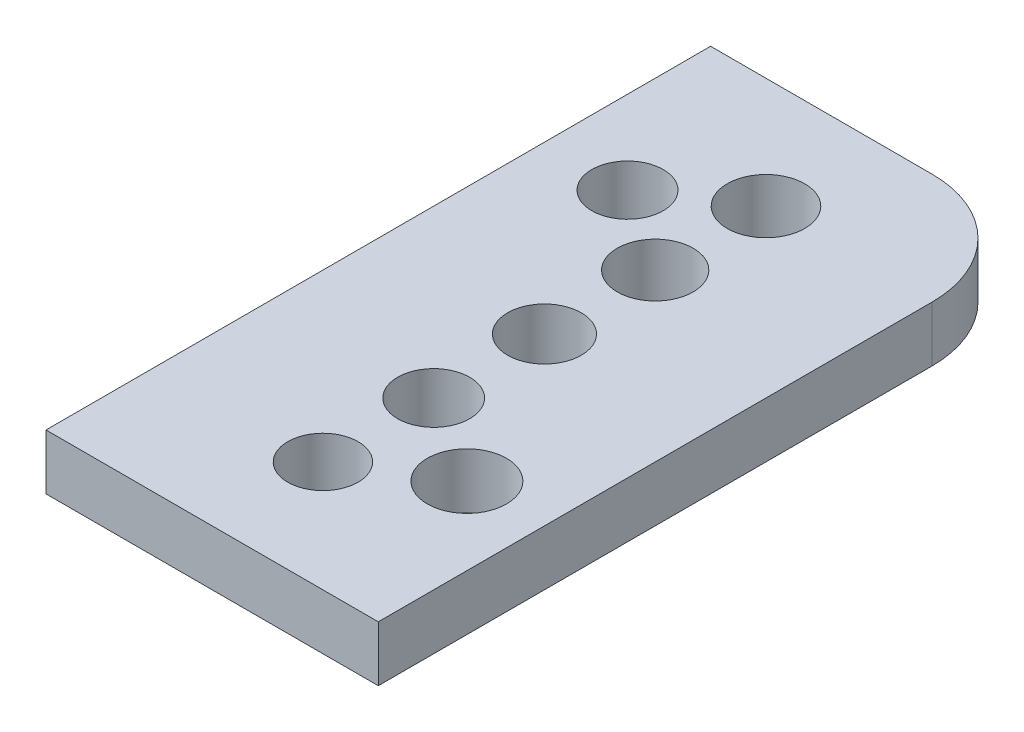
ISO-10303-21;
HEADER;
FILE_DESCRIPTION(('STEP AP214'),'2;1');
FILE_NAME('part.step','',(''),(''),'','','');
FILE_SCHEMA(('AUTOMOTIVE_DESIGN { 1 0 10303 214 1 1 1 1 }'));
ENDSEC;
DATA;
#1=APPLICATION_CONTEXT('core data for automotive mechanical design processes');
#2=APPLICATION_PROTOCOL_DEFINITION('international standard','automotive_design',2000,#1);
#3=PRODUCT_CONTEXT('',#1,'mechanical');
#4=PRODUCT('Part','Part','',(#3));
#5=PRODUCT_RELATED_PRODUCT_CATEGORY('part','',(#4));
#6=PRODUCT_DEFINITION_FORMATION('','',#4);
#7=PRODUCT_DEFINITION_CONTEXT('part definition',#1,'design');
#8=PRODUCT_DEFINITION('design','',#6,#7);
#9=PRODUCT_DEFINITION_SHAPE('','',#8);
#10=(LENGTH_UNIT() NAMED_UNIT(*) SI_UNIT(.MILLI.,.METRE.));
#11=(NAMED_UNIT(*) PLANE_ANGLE_UNIT() SI_UNIT($,.RADIAN.));
#12=(NAMED_UNIT(*) SI_UNIT($,.STERADIAN.) SOLID_ANGLE_UNIT());
#13=UNCERTAINTY_MEASURE_WITH_UNIT(LENGTH_MEASURE(1.E-05),#10,'distance_accuracy_value','');
#14=(GEOMETRIC_REPRESENTATION_CONTEXT(3) GLOBAL_UNCERTAINTY_ASSIGNED_CONTEXT((#13)) GLOBAL_UNIT_ASSIGNED_CONTEXT((#10,
#11,#12)) REPRESENTATION_CONTEXT('',''));
#15=CARTESIAN_POINT('',(0.,0.,0.));
#16=DIRECTION('',(0.,0.,1.));
#17=DIRECTION('',(1.,0.,0.));
#18=AXIS2_PLACEMENT_3D('',#15,#16,#17);
#19=CARTESIAN_POINT('',(15.,5.,-30.));
#20=DIRECTION('',(-1.,0.,0.));
#21=DIRECTION('',(0.,0.,1.));
#22=AXIS2_PLACEMENT_3D('',#19,#20,#21);
#23=PLANE('',#22);
#24=DIRECTION('',(0.,0.,-1.));
#25=VECTOR('',#24,1.);
#26=CARTESIAN_POINT('',(15.,0.,-30.));
#27=LINE('',#26,#25);
#28=CARTESIAN_POINT('',(15.,0.,30.));
#29=VERTEX_POINT('',#28);
#30=CARTESIAN_POINT('',(15.,0.,-20.));
#31=VERTEX_POINT('',#30);
#32=EDGE_CURVE('E109',#29,#31,#27,.T.);
#33=ORIENTED_EDGE('',*,*,#32,.T.);
#34=DIRECTION('',(0.,-1.,0.));
#35=VECTOR('',#34,1.);
#36=CARTESIAN_POINT('',(15.,5.,-20.));
#37=LINE('',#36,#35);
#38=CARTESIAN_POINT('',(15.,5.,-20.));
#39=VERTEX_POINT('',#38);
#40=EDGE_CURVE('E41',#31,#39,#37,.F.);
#41=ORIENTED_EDGE('',*,*,#40,.T.);
#42=DIRECTION('',(0.,0.,-1.));
#43=VECTOR('',#42,1.);
#44=CARTESIAN_POINT('',(15.,5.,-30.));
#45=LINE('',#44,#43);
#46=CARTESIAN_POINT('',(15.,5.,30.));
#47=VERTEX_POINT('',#46);
#48=EDGE_CURVE('E89',#47,#39,#45,.T.);
#49=ORIENTED_EDGE('',*,*,#48,.F.);
#50=DIRECTION('',(0.,-1.,0.));
#51=VECTOR('',#50,1.);
#52=CARTESIAN_POINT('',(15.,5.,30.));
#53=LINE('',#52,#51);
#54=EDGE_CURVE('E105',#47,#29,#53,.T.);
#55=ORIENTED_EDGE('',*,*,#54,.T.);
#56=EDGE_LOOP('',(#33,#41,#49,#55));
#57=FACE_BOUND('',#56,.T.);
#58=ADVANCED_FACE('F33',(#57),#23,.F.);
#59=CARTESIAN_POINT('',(-15.,5.,-30.));
#60=DIRECTION('',(0.,0.,1.));
#61=DIRECTION('',(1.,0.,0.));
#62=AXIS2_PLACEMENT_3D('',#59,#60,#61);
#63=PLANE('',#62);
#64=DIRECTION('',(-1.,0.,0.));
#65=VECTOR('',#64,1.);
#66=CARTESIAN_POINT('',(-15.,5.,-30.));
#67=LINE('',#66,#65);
#68=CARTESIAN_POINT('',(4.99999999999999,5.,-30.));
#69=VERTEX_POINT('',#68);
#70=CARTESIAN_POINT('',(-15.,5.,-30.));
#71=VERTEX_POINT('',#70);
#72=EDGE_CURVE('E79',#69,#71,#67,.T.);
#73=ORIENTED_EDGE('',*,*,#72,.F.);
#74=DIRECTION('',(0.,-1.,0.));
#75=VECTOR('',#74,1.);
#76=CARTESIAN_POINT('',(4.99999999999999,5.,-30.));
#77=LINE('',#76,#75);
#78=CARTESIAN_POINT('',(4.99999999999999,0.,-30.));
#79=VERTEX_POINT('',#78);
#80=EDGE_CURVE('E97',#69,#79,#77,.T.);
#81=ORIENTED_EDGE('',*,*,#80,.T.);
#82=DIRECTION('',(-1.,0.,0.));
#83=VECTOR('',#82,1.);
#84=CARTESIAN_POINT('',(-15.,0.,-30.));
#85=LINE('',#84,#83);
#86=CARTESIAN_POINT('',(-15.,0.,-30.));
#87=VERTEX_POINT('',#86);
#88=EDGE_CURVE('E94',#79,#87,#85,.T.);
#89=ORIENTED_EDGE('',*,*,#88,.T.);
#90=DIRECTION('',(0.,-1.,0.));
#91=VECTOR('',#90,1.);
#92=CARTESIAN_POINT('',(-15.,5.,-30.));
#93=LINE('',#92,#91);
#94=EDGE_CURVE('E92',#71,#87,#93,.T.);
#95=ORIENTED_EDGE('',*,*,#94,.F.);
#96=EDGE_LOOP('',(#73,#81,#89,#95));
#97=FACE_BOUND('',#96,.T.);
#98=ADVANCED_FACE('F93',(#97),#63,.F.);
#99=CARTESIAN_POINT('',(-15.,5.,-30.));
#100=DIRECTION('',(1.,0.,0.));
#101=DIRECTION('',(0.,0.,-1.));
#102=AXIS2_PLACEMENT_3D('',#99,#100,#101);
#103=PLANE('',#102);
#104=DIRECTION('',(0.,0.,1.));
#105=VECTOR('',#104,1.);
#106=CARTESIAN_POINT('',(-15.,0.,-30.));
#107=LINE('',#106,#105);
#108=CARTESIAN_POINT('',(-15.,0.,30.));
#109=VERTEX_POINT('',#108);
#110=EDGE_CURVE('E113',#87,#109,#107,.T.);
#111=ORIENTED_EDGE('',*,*,#110,.T.);
#112=DIRECTION('',(0.,-1.,0.));
#113=VECTOR('',#112,1.);
#114=CARTESIAN_POINT('',(-15.,5.,30.));
#115=LINE('',#114,#113);
#116=CARTESIAN_POINT('',(-15.,5.,30.));
#117=VERTEX_POINT('',#116);
#118=EDGE_CURVE('E98',#117,#109,#115,.T.);
#119=ORIENTED_EDGE('',*,*,#118,.F.);
#120=DIRECTION('',(0.,0.,1.));
#121=VECTOR('',#120,1.);
#122=CARTESIAN_POINT('',(-15.,5.,-30.));
#123=LINE('',#122,#121);
#124=EDGE_CURVE('E83',#71,#117,#123,.T.);
#125=ORIENTED_EDGE('',*,*,#124,.F.);
#126=ORIENTED_EDGE('',*,*,#94,.T.);
#127=EDGE_LOOP('',(#111,#119,#125,#126));
#128=FACE_BOUND('',#127,.T.);
#129=ADVANCED_FACE('F100',(#128),#103,.F.);
#130=CARTESIAN_POINT('',(-15.,5.,30.));
#131=DIRECTION('',(0.,0.,-1.));
#132=DIRECTION('',(-1.,0.,0.));
#133=AXIS2_PLACEMENT_3D('',#130,#131,#132);
#134=PLANE('',#133);
#135=DIRECTION('',(1.,0.,0.));
#136=VECTOR('',#135,1.);
#137=CARTESIAN_POINT('',(-15.,0.,30.));
#138=LINE('',#137,#136);
#139=EDGE_CURVE('E115',#109,#29,#138,.T.);
#140=ORIENTED_EDGE('',*,*,#139,.T.);
#141=ORIENTED_EDGE('',*,*,#54,.F.);
#142=DIRECTION('',(1.,0.,0.));
#143=VECTOR('',#142,1.);
#144=CARTESIAN_POINT('',(-15.,5.,30.));
#145=LINE('',#144,#143);
#146=EDGE_CURVE('E103',#117,#47,#145,.T.);
#147=ORIENTED_EDGE('',*,*,#146,.F.);
#148=ORIENTED_EDGE('',*,*,#118,.T.);
#149=EDGE_LOOP('',(#140,#141,#147,#148));
#150=FACE_BOUND('',#149,.T.);
#151=ADVANCED_FACE('F125',(#150),#134,.F.);
#152=CARTESIAN_POINT('',(0.,5.,0.));
#153=DIRECTION('',(0.,1.,0.));
#154=DIRECTION('',(0.,0.,1.));
#155=AXIS2_PLACEMENT_3D('',#152,#153,#154);
#156=PLANE('',#155);
#157=CARTESIAN_POINT('',(0.,5.,10.));
#158=DIRECTION('',(0.,1.,0.));
#159=DIRECTION('',(0.,0.,1.));
#160=AXIS2_PLACEMENT_3D('',#157,#158,#159);
#161=CIRCLE('',#160,3.25);
#162=CARTESIAN_POINT('',(0.,5.,13.25));
#163=VERTEX_POINT('',#162);
#164=EDGE_CURVE('E196',#163,#163,#161,.T.);
#165=ORIENTED_EDGE('',*,*,#164,.F.);
#166=EDGE_LOOP('',(#165));
#167=FACE_BOUND('',#166,.T.);
#168=CARTESIAN_POINT('',(0.,5.,0.));
#169=DIRECTION('',(0.,1.,0.));
#170=DIRECTION('',(0.,0.,1.));
#171=AXIS2_PLACEMENT_3D('',#168,#169,#170);
#172=CIRCLE('',#171,3.325);
#173=CARTESIAN_POINT('',(0.,5.,3.325));
#174=VERTEX_POINT('',#173);
#175=EDGE_CURVE('E204',#174,#174,#172,.T.);
#176=ORIENTED_EDGE('',*,*,#175,.F.);
#177=EDGE_LOOP('',(#176));
#178=FACE_BOUND('',#177,.T.);
#179=CARTESIAN_POINT('',(0.,5.,-10.));
#180=DIRECTION('',(0.,1.,0.));
#181=DIRECTION('',(0.,0.,1.));
#182=AXIS2_PLACEMENT_3D('',#179,#180,#181);
#183=CIRCLE('',#182,3.425);
#184=CARTESIAN_POINT('',(0.,5.,-6.575));
#185=VERTEX_POINT('',#184);
#186=EDGE_CURVE('E210',#185,#185,#183,.T.);
#187=ORIENTED_EDGE('',*,*,#186,.F.);
#188=EDGE_LOOP('',(#187));
#189=FACE_BOUND('',#188,.T.);
#190=CARTESIAN_POINT('',(0.,5.,-20.));
#191=DIRECTION('',(0.,1.,0.));
#192=DIRECTION('',(0.,0.,1.));
#193=AXIS2_PLACEMENT_3D('',#190,#191,#192);
#194=CIRCLE('',#193,3.5);
#195=CARTESIAN_POINT('',(0.,5.,-16.5));
#196=VERTEX_POINT('',#195);
#197=EDGE_CURVE('E183',#196,#196,#194,.T.);
#198=ORIENTED_EDGE('',*,*,#197,.F.);
#199=EDGE_LOOP('',(#198));
#200=FACE_BOUND('',#199,.T.);
#201=CARTESIAN_POINT('',(8.,5.,15.));
#202=DIRECTION('',(0.,1.,0.));
#203=DIRECTION('',(0.,0.,1.));
#204=AXIS2_PLACEMENT_3D('',#201,#202,#203);
#205=CIRCLE('',#204,3.575);
#206=CARTESIAN_POINT('',(8.,5.,18.575));
#207=VERTEX_POINT('',#206);
#208=EDGE_CURVE('E178',#207,#207,#205,.T.);
#209=ORIENTED_EDGE('',*,*,#208,.F.);
#210=EDGE_LOOP('',(#209));
#211=FACE_BOUND('',#210,.T.);
#212=CARTESIAN_POINT('',(-7.5,5.,-15.));
#213=DIRECTION('',(0.,1.,0.));
#214=DIRECTION('',(0.,0.,1.));
#215=AXIS2_PLACEMENT_3D('',#212,#213,#214);
#216=CIRCLE('',#215,3.225);
#217=CARTESIAN_POINT('',(-7.5,5.,-11.775));
#218=VERTEX_POINT('',#217);
#219=EDGE_CURVE('E191',#218,#218,#216,.T.);
#220=ORIENTED_EDGE('',*,*,#219,.F.);
#221=EDGE_LOOP('',(#220));
#222=FACE_BOUND('',#221,.T.);
#223=CARTESIAN_POINT('',(0.,5.,20.));
#224=DIRECTION('',(0.,1.,0.));
#225=DIRECTION('',(0.,0.,1.));
#226=AXIS2_PLACEMENT_3D('',#223,#224,#225);
#227=CIRCLE('',#226,3.175);
#228=CARTESIAN_POINT('',(0.,5.,23.175));
#229=VERTEX_POINT('',#228);
#230=EDGE_CURVE('E203',#229,#229,#227,.T.);
#231=ORIENTED_EDGE('',*,*,#230,.F.);
#232=EDGE_LOOP('',(#231));
#233=FACE_BOUND('',#232,.T.);
#234=ORIENTED_EDGE('',*,*,#48,.T.);
#235=CARTESIAN_POINT('',(4.99999999999999,5.,-20.));
#236=DIRECTION('',(0.,1.,0.));
#237=DIRECTION('',(0.,0.,1.));
#238=AXIS2_PLACEMENT_3D('',#235,#236,#237);
#239=CIRCLE('',#238,10.);
#240=EDGE_CURVE('E11',#39,#69,#239,.T.);
#241=ORIENTED_EDGE('',*,*,#240,.T.);
#242=ORIENTED_EDGE('',*,*,#72,.T.);
#243=ORIENTED_EDGE('',*,*,#124,.T.);
#244=ORIENTED_EDGE('',*,*,#146,.T.);
#245=EDGE_LOOP('',(#234,#241,#242,#243,#244));
#246=FACE_BOUND('',#245,.T.);
#247=ADVANCED_FACE('F81',(#167,#178,#189,#200,#211,#222,#233,#246),#156,.T.);
#248=CARTESIAN_POINT('',(0.,0.,0.));
#249=DIRECTION('',(0.,1.,0.));
#250=DIRECTION('',(0.,0.,1.));
#251=AXIS2_PLACEMENT_3D('',#248,#249,#250);
#252=PLANE('',#251);
#253=CARTESIAN_POINT('',(0.,0.,10.));
#254=DIRECTION('',(0.,1.,0.));
#255=DIRECTION('',(0.,0.,1.));
#256=AXIS2_PLACEMENT_3D('',#253,#254,#255);
#257=CIRCLE('',#256,3.25);
#258=CARTESIAN_POINT('',(0.,0.,13.25));
#259=VERTEX_POINT('',#258);
#260=EDGE_CURVE('E199',#259,#259,#257,.F.);
#261=ORIENTED_EDGE('',*,*,#260,.F.);
#262=EDGE_LOOP('',(#261));
#263=FACE_BOUND('',#262,.T.);
#264=CARTESIAN_POINT('',(0.,0.,0.));
#265=DIRECTION('',(0.,1.,0.));
#266=DIRECTION('',(0.,0.,1.));
#267=AXIS2_PLACEMENT_3D('',#264,#265,#266);
#268=CIRCLE('',#267,3.325);
#269=CARTESIAN_POINT('',(0.,0.,3.325));
#270=VERTEX_POINT('',#269);
#271=EDGE_CURVE('E200',#270,#270,#268,.F.);
#272=ORIENTED_EDGE('',*,*,#271,.F.);
#273=EDGE_LOOP('',(#272));
#274=FACE_BOUND('',#273,.T.);
#275=CARTESIAN_POINT('',(0.,0.,-10.));
#276=DIRECTION('',(0.,1.,0.));
#277=DIRECTION('',(0.,0.,1.));
#278=AXIS2_PLACEMENT_3D('',#275,#276,#277);
#279=CIRCLE('',#278,3.425);
#280=CARTESIAN_POINT('',(0.,0.,-6.575));
#281=VERTEX_POINT('',#280);
#282=EDGE_CURVE('E207',#281,#281,#279,.F.);
#283=ORIENTED_EDGE('',*,*,#282,.F.);
#284=EDGE_LOOP('',(#283));
#285=FACE_BOUND('',#284,.T.);
#286=CARTESIAN_POINT('',(0.,0.,-20.));
#287=DIRECTION('',(0.,1.,0.));
#288=DIRECTION('',(0.,0.,1.));
#289=AXIS2_PLACEMENT_3D('',#286,#287,#288);
#290=CIRCLE('',#289,3.5);
#291=CARTESIAN_POINT('',(0.,0.,-16.5));
#292=VERTEX_POINT('',#291);
#293=EDGE_CURVE('E186',#292,#292,#290,.F.);
#294=ORIENTED_EDGE('',*,*,#293,.F.);
#295=EDGE_LOOP('',(#294));
#296=FACE_BOUND('',#295,.T.);
#297=CARTESIAN_POINT('',(8.,0.,15.));
#298=DIRECTION('',(0.,1.,0.));
#299=DIRECTION('',(0.,0.,1.));
#300=AXIS2_PLACEMENT_3D('',#297,#298,#299);
#301=CIRCLE('',#300,3.575);
#302=CARTESIAN_POINT('',(8.,0.,18.575));
#303=VERTEX_POINT('',#302);
#304=EDGE_CURVE('E181',#303,#303,#301,.F.);
#305=ORIENTED_EDGE('',*,*,#304,.F.);
#306=EDGE_LOOP('',(#305));
#307=FACE_BOUND('',#306,.T.);
#308=CARTESIAN_POINT('',(-7.5,0.,-15.));
#309=DIRECTION('',(0.,1.,0.));
#310=DIRECTION('',(0.,0.,1.));
#311=AXIS2_PLACEMENT_3D('',#308,#309,#310);
#312=CIRCLE('',#311,3.225);
#313=CARTESIAN_POINT('',(-7.5,0.,-11.775));
#314=VERTEX_POINT('',#313);
#315=EDGE_CURVE('E188',#314,#314,#312,.F.);
#316=ORIENTED_EDGE('',*,*,#315,.F.);
#317=EDGE_LOOP('',(#316));
#318=FACE_BOUND('',#317,.T.);
#319=CARTESIAN_POINT('',(0.,0.,20.));
#320=DIRECTION('',(0.,1.,0.));
#321=DIRECTION('',(0.,0.,1.));
#322=AXIS2_PLACEMENT_3D('',#319,#320,#321);
#323=CIRCLE('',#322,3.175);
#324=CARTESIAN_POINT('',(0.,0.,23.175));
#325=VERTEX_POINT('',#324);
#326=EDGE_CURVE('E111',#325,#325,#323,.F.);
#327=ORIENTED_EDGE('',*,*,#326,.F.);
#328=EDGE_LOOP('',(#327));
#329=FACE_BOUND('',#328,.T.);
#330=ORIENTED_EDGE('',*,*,#88,.F.);
#331=CARTESIAN_POINT('',(4.99999999999999,0.,-20.));
#332=DIRECTION('',(0.,1.,0.));
#333=DIRECTION('',(0.,0.,1.));
#334=AXIS2_PLACEMENT_3D('',#331,#332,#333);
#335=CIRCLE('',#334,10.);
#336=EDGE_CURVE('E55',#79,#31,#335,.F.);
#337=ORIENTED_EDGE('',*,*,#336,.T.);
#338=ORIENTED_EDGE('',*,*,#32,.F.);
#339=ORIENTED_EDGE('',*,*,#139,.F.);
#340=ORIENTED_EDGE('',*,*,#110,.F.);
#341=EDGE_LOOP('',(#330,#337,#338,#339,#340));
#342=FACE_BOUND('',#341,.T.);
#343=ADVANCED_FACE('F122',(#263,#274,#285,#296,#307,#318,#329,#342),#252,.F.);
#344=CARTESIAN_POINT('',(0.,-0.00100000000000013,20.));
#345=DIRECTION('',(0.,1.,0.));
#346=DIRECTION('',(0.,0.,1.));
#347=AXIS2_PLACEMENT_3D('',#344,#345,#346);
#348=CYLINDRICAL_SURFACE('',#347,3.175);
#349=ORIENTED_EDGE('',*,*,#230,.T.);
#350=EDGE_LOOP('',(#349));
#351=FACE_BOUND('',#350,.T.);
#352=ORIENTED_EDGE('',*,*,#326,.T.);
#353=EDGE_LOOP('',(#352));
#354=FACE_BOUND('',#353,.T.);
#355=ADVANCED_FACE('F147',(#351,#354),#348,.F.);
#356=CARTESIAN_POINT('',(-7.5,-0.00100000000000013,-15.));
#357=DIRECTION('',(0.,1.,0.));
#358=DIRECTION('',(0.,0.,1.));
#359=AXIS2_PLACEMENT_3D('',#356,#357,#358);
#360=CYLINDRICAL_SURFACE('',#359,3.225);
#361=ORIENTED_EDGE('',*,*,#219,.T.);
#362=EDGE_LOOP('',(#361));
#363=FACE_BOUND('',#362,.T.);
#364=ORIENTED_EDGE('',*,*,#315,.T.);
#365=EDGE_LOOP('',(#364));
#366=FACE_BOUND('',#365,.T.);
#367=ADVANCED_FACE('F154',(#363,#366),#360,.F.);
#368=CARTESIAN_POINT('',(8.,-0.00100000000000013,15.));
#369=DIRECTION('',(0.,1.,0.));
#370=DIRECTION('',(0.,0.,1.));
#371=AXIS2_PLACEMENT_3D('',#368,#369,#370);
#372=CYLINDRICAL_SURFACE('',#371,3.575);
#373=ORIENTED_EDGE('',*,*,#208,.T.);
#374=EDGE_LOOP('',(#373));
#375=FACE_BOUND('',#374,.T.);
#376=ORIENTED_EDGE('',*,*,#304,.T.);
#377=EDGE_LOOP('',(#376));
#378=FACE_BOUND('',#377,.T.);
#379=ADVANCED_FACE('F160',(#375,#378),#372,.F.);
#380=CARTESIAN_POINT('',(0.,-0.00100000000000013,-20.));
#381=DIRECTION('',(0.,1.,0.));
#382=DIRECTION('',(0.,0.,1.));
#383=AXIS2_PLACEMENT_3D('',#380,#381,#382);
#384=CYLINDRICAL_SURFACE('',#383,3.5);
#385=ORIENTED_EDGE('',*,*,#197,.T.);
#386=EDGE_LOOP('',(#385));
#387=FACE_BOUND('',#386,.T.);
#388=ORIENTED_EDGE('',*,*,#293,.T.);
#389=EDGE_LOOP('',(#388));
#390=FACE_BOUND('',#389,.T.);
#391=ADVANCED_FACE('F156',(#387,#390),#384,.F.);
#392=CARTESIAN_POINT('',(0.,-0.00100000000000013,-10.));
#393=DIRECTION('',(0.,1.,0.));
#394=DIRECTION('',(0.,0.,1.));
#395=AXIS2_PLACEMENT_3D('',#392,#393,#394);
#396=CYLINDRICAL_SURFACE('',#395,3.425);
#397=ORIENTED_EDGE('',*,*,#186,.T.);
#398=EDGE_LOOP('',(#397));
#399=FACE_BOUND('',#398,.T.);
#400=ORIENTED_EDGE('',*,*,#282,.T.);
#401=EDGE_LOOP('',(#400));
#402=FACE_BOUND('',#401,.T.);
#403=ADVANCED_FACE('F159',(#399,#402),#396,.F.);
#404=CARTESIAN_POINT('',(0.,-0.00100000000000013,0.));
#405=DIRECTION('',(0.,1.,0.));
#406=DIRECTION('',(0.,0.,1.));
#407=AXIS2_PLACEMENT_3D('',#404,#405,#406);
#408=CYLINDRICAL_SURFACE('',#407,3.325);
#409=ORIENTED_EDGE('',*,*,#175,.T.);
#410=EDGE_LOOP('',(#409));
#411=FACE_BOUND('',#410,.T.);
#412=ORIENTED_EDGE('',*,*,#271,.T.);
#413=EDGE_LOOP('',(#412));
#414=FACE_BOUND('',#413,.T.);
#415=ADVANCED_FACE('F132',(#411,#414),#408,.F.);
#416=CARTESIAN_POINT('',(0.,-0.00100000000000013,10.));
#417=DIRECTION('',(0.,1.,0.));
#418=DIRECTION('',(0.,0.,1.));
#419=AXIS2_PLACEMENT_3D('',#416,#417,#418);
#420=CYLINDRICAL_SURFACE('',#419,3.25);
#421=ORIENTED_EDGE('',*,*,#164,.T.);
#422=EDGE_LOOP('',(#421));
#423=FACE_BOUND('',#422,.T.);
#424=ORIENTED_EDGE('',*,*,#260,.T.);
#425=EDGE_LOOP('',(#424));
#426=FACE_BOUND('',#425,.T.);
#427=ADVANCED_FACE('F128',(#423,#426),#420,.F.);
#428=CARTESIAN_POINT('',(4.99999999999999,5.,-20.));
#429=DIRECTION('',(0.,-1.,0.));
#430=DIRECTION('',(0.,0.,-1.));
#431=AXIS2_PLACEMENT_3D('',#428,#429,#430);
#432=CYLINDRICAL_SURFACE('',#431,10.);
#433=ORIENTED_EDGE('',*,*,#240,.F.);
#434=ORIENTED_EDGE('',*,*,#40,.F.);
#435=ORIENTED_EDGE('',*,*,#336,.F.);
#436=ORIENTED_EDGE('',*,*,#80,.F.);
#437=EDGE_LOOP('',(#433,#434,#435,#436));
#438=FACE_BOUND('',#437,.T.);
#439=ADVANCED_FACE('F35',(#438),#432,.T.);
#440=CLOSED_SHELL('',(#58,#98,#129,#151,#247,#343,#355,#367,#379,#391,#403,#415,#427,#439));
#441=MANIFOLD_SOLID_BREP('B2',#440);
#442=ADVANCED_BREP_SHAPE_REPRESENTATION('',(#18,#441),#14);
#443=SHAPE_DEFINITION_REPRESENTATION(#9,#442);
ENDSEC;
END-ISO-10303-21;
